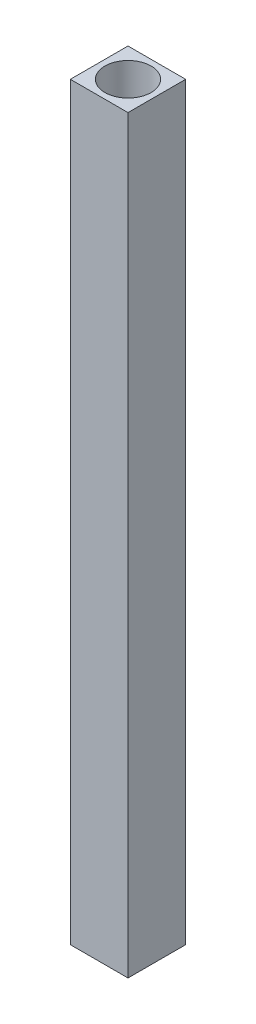
ISO-10303-21;
HEADER;
FILE_DESCRIPTION(('STEP AP214'),'2;1');
FILE_NAME('part.step','',(''),(''),'','','');
FILE_SCHEMA(('AUTOMOTIVE_DESIGN { 1 0 10303 214 1 1 1 1 }'));
ENDSEC;
DATA;
#1=APPLICATION_CONTEXT('core data for automotive mechanical design processes');
#2=APPLICATION_PROTOCOL_DEFINITION('international standard','automotive_design',2000,#1);
#3=PRODUCT_CONTEXT('',#1,'mechanical');
#4=PRODUCT('Part','Part','',(#3));
#5=PRODUCT_RELATED_PRODUCT_CATEGORY('part','',(#4));
#6=PRODUCT_DEFINITION_FORMATION('','',#4);
#7=PRODUCT_DEFINITION_CONTEXT('part definition',#1,'design');
#8=PRODUCT_DEFINITION('design','',#6,#7);
#9=PRODUCT_DEFINITION_SHAPE('','',#8);
#10=(LENGTH_UNIT() NAMED_UNIT(*) SI_UNIT(.MILLI.,.METRE.));
#11=(NAMED_UNIT(*) PLANE_ANGLE_UNIT() SI_UNIT($,.RADIAN.));
#12=(NAMED_UNIT(*) SI_UNIT($,.STERADIAN.) SOLID_ANGLE_UNIT());
#13=UNCERTAINTY_MEASURE_WITH_UNIT(LENGTH_MEASURE(1.E-05),#10,'distance_accuracy_value','');
#14=(GEOMETRIC_REPRESENTATION_CONTEXT(3) GLOBAL_UNCERTAINTY_ASSIGNED_CONTEXT((#13)) GLOBAL_UNIT_ASSIGNED_CONTEXT((#10,
#11,#12)) REPRESENTATION_CONTEXT('',''));
#15=CARTESIAN_POINT('',(0.,0.,0.));
#16=DIRECTION('',(0.,0.,1.));
#17=DIRECTION('',(1.,0.,0.));
#18=AXIS2_PLACEMENT_3D('',#15,#16,#17);
#19=CARTESIAN_POINT('',(5.,130.,5.));
#20=DIRECTION('',(-1.,0.,0.));
#21=DIRECTION('',(0.,0.,1.));
#22=AXIS2_PLACEMENT_3D('',#19,#20,#21);
#23=PLANE('',#22);
#24=DIRECTION('',(0.,0.,-1.));
#25=VECTOR('',#24,1.);
#26=CARTESIAN_POINT('',(5.,0.,5.));
#27=LINE('',#26,#25);
#28=CARTESIAN_POINT('',(5.,0.,5.));
#29=VERTEX_POINT('',#28);
#30=CARTESIAN_POINT('',(5.,0.,-5.));
#31=VERTEX_POINT('',#30);
#32=EDGE_CURVE('E106',#29,#31,#27,.T.);
#33=ORIENTED_EDGE('',*,*,#32,.T.);
#34=DIRECTION('',(0.,-1.,0.));
#35=VECTOR('',#34,1.);
#36=CARTESIAN_POINT('',(5.,130.,-5.));
#37=LINE('',#36,#35);
#38=CARTESIAN_POINT('',(5.,130.,-5.));
#39=VERTEX_POINT('',#38);
#40=EDGE_CURVE('E11',#39,#31,#37,.T.);
#41=ORIENTED_EDGE('',*,*,#40,.F.);
#42=DIRECTION('',(0.,0.,-1.));
#43=VECTOR('',#42,1.);
#44=CARTESIAN_POINT('',(5.,130.,5.));
#45=LINE('',#44,#43);
#46=CARTESIAN_POINT('',(5.,130.,5.));
#47=VERTEX_POINT('',#46);
#48=EDGE_CURVE('E90',#47,#39,#45,.T.);
#49=ORIENTED_EDGE('',*,*,#48,.F.);
#50=DIRECTION('',(0.,-1.,0.));
#51=VECTOR('',#50,1.);
#52=CARTESIAN_POINT('',(5.,130.,5.));
#53=LINE('',#52,#51);
#54=EDGE_CURVE('E102',#47,#29,#53,.T.);
#55=ORIENTED_EDGE('',*,*,#54,.T.);
#56=EDGE_LOOP('',(#33,#41,#49,#55));
#57=FACE_BOUND('',#56,.T.);
#58=ADVANCED_FACE('F38',(#57),#23,.F.);
#59=CARTESIAN_POINT('',(-5.,130.,-5.));
#60=DIRECTION('',(0.,0.,1.));
#61=DIRECTION('',(1.,0.,0.));
#62=AXIS2_PLACEMENT_3D('',#59,#60,#61);
#63=PLANE('',#62);
#64=DIRECTION('',(-1.,0.,0.));
#65=VECTOR('',#64,1.);
#66=CARTESIAN_POINT('',(-5.,0.,-5.));
#67=LINE('',#66,#65);
#68=CARTESIAN_POINT('',(-5.,0.,-5.));
#69=VERTEX_POINT('',#68);
#70=EDGE_CURVE('E95',#31,#69,#67,.T.);
#71=ORIENTED_EDGE('',*,*,#70,.T.);
#72=DIRECTION('',(0.,-1.,0.));
#73=VECTOR('',#72,1.);
#74=CARTESIAN_POINT('',(-5.,130.,-5.));
#75=LINE('',#74,#73);
#76=CARTESIAN_POINT('',(-5.,130.,-5.));
#77=VERTEX_POINT('',#76);
#78=EDGE_CURVE('E47',#77,#69,#75,.T.);
#79=ORIENTED_EDGE('',*,*,#78,.F.);
#80=DIRECTION('',(-1.,0.,0.));
#81=VECTOR('',#80,1.);
#82=CARTESIAN_POINT('',(-5.,130.,-5.));
#83=LINE('',#82,#81);
#84=EDGE_CURVE('E85',#39,#77,#83,.T.);
#85=ORIENTED_EDGE('',*,*,#84,.F.);
#86=ORIENTED_EDGE('',*,*,#40,.T.);
#87=EDGE_LOOP('',(#71,#79,#85,#86));
#88=FACE_BOUND('',#87,.T.);
#89=ADVANCED_FACE('F94',(#88),#63,.F.);
#90=CARTESIAN_POINT('',(-5.,130.,5.));
#91=DIRECTION('',(1.,0.,0.));
#92=DIRECTION('',(0.,0.,-1.));
#93=AXIS2_PLACEMENT_3D('',#90,#91,#92);
#94=PLANE('',#93);
#95=DIRECTION('',(0.,0.,1.));
#96=VECTOR('',#95,1.);
#97=CARTESIAN_POINT('',(-5.,0.,5.));
#98=LINE('',#97,#96);
#99=CARTESIAN_POINT('',(-5.,0.,5.));
#100=VERTEX_POINT('',#99);
#101=EDGE_CURVE('E72',#69,#100,#98,.T.);
#102=ORIENTED_EDGE('',*,*,#101,.T.);
#103=DIRECTION('',(0.,-1.,0.));
#104=VECTOR('',#103,1.);
#105=CARTESIAN_POINT('',(-5.,130.,5.));
#106=LINE('',#105,#104);
#107=CARTESIAN_POINT('',(-5.,130.,5.));
#108=VERTEX_POINT('',#107);
#109=EDGE_CURVE('E97',#108,#100,#106,.T.);
#110=ORIENTED_EDGE('',*,*,#109,.F.);
#111=DIRECTION('',(0.,0.,1.));
#112=VECTOR('',#111,1.);
#113=CARTESIAN_POINT('',(-5.,130.,5.));
#114=LINE('',#113,#112);
#115=EDGE_CURVE('E88',#77,#108,#114,.T.);
#116=ORIENTED_EDGE('',*,*,#115,.F.);
#117=ORIENTED_EDGE('',*,*,#78,.T.);
#118=EDGE_LOOP('',(#102,#110,#116,#117));
#119=FACE_BOUND('',#118,.T.);
#120=ADVANCED_FACE('F98',(#119),#94,.F.);
#121=CARTESIAN_POINT('',(-5.,130.,5.));
#122=DIRECTION('',(0.,0.,-1.));
#123=DIRECTION('',(-1.,0.,0.));
#124=AXIS2_PLACEMENT_3D('',#121,#122,#123);
#125=PLANE('',#124);
#126=DIRECTION('',(1.,0.,0.));
#127=VECTOR('',#126,1.);
#128=CARTESIAN_POINT('',(-5.,0.,5.));
#129=LINE('',#128,#127);
#130=EDGE_CURVE('E78',#100,#29,#129,.T.);
#131=ORIENTED_EDGE('',*,*,#130,.T.);
#132=ORIENTED_EDGE('',*,*,#54,.F.);
#133=DIRECTION('',(1.,0.,0.));
#134=VECTOR('',#133,1.);
#135=CARTESIAN_POINT('',(-5.,130.,5.));
#136=LINE('',#135,#134);
#137=EDGE_CURVE('E55',#108,#47,#136,.T.);
#138=ORIENTED_EDGE('',*,*,#137,.F.);
#139=ORIENTED_EDGE('',*,*,#109,.T.);
#140=EDGE_LOOP('',(#131,#132,#138,#139));
#141=FACE_BOUND('',#140,.T.);
#142=ADVANCED_FACE('F120',(#141),#125,.F.);
#143=CARTESIAN_POINT('',(0.,130.,0.));
#144=DIRECTION('',(0.,-1.,0.));
#145=DIRECTION('',(0.,0.,-1.));
#146=AXIS2_PLACEMENT_3D('',#143,#144,#145);
#147=PLANE('',#146);
#148=CARTESIAN_POINT('',(0.,130.,0.));
#149=DIRECTION('',(0.,-1.,0.));
#150=DIRECTION('',(0.,0.,-1.));
#151=AXIS2_PLACEMENT_3D('',#148,#149,#150);
#152=CIRCLE('',#151,4.);
#153=CARTESIAN_POINT('',(0.,130.,-4.));
#154=VERTEX_POINT('',#153);
#155=EDGE_CURVE('E127',#154,#154,#152,.T.);
#156=ORIENTED_EDGE('',*,*,#155,.T.);
#157=EDGE_LOOP('',(#156));
#158=FACE_BOUND('',#157,.T.);
#159=ORIENTED_EDGE('',*,*,#48,.T.);
#160=ORIENTED_EDGE('',*,*,#84,.T.);
#161=ORIENTED_EDGE('',*,*,#115,.T.);
#162=ORIENTED_EDGE('',*,*,#137,.T.);
#163=EDGE_LOOP('',(#159,#160,#161,#162));
#164=FACE_BOUND('',#163,.T.);
#165=ADVANCED_FACE('F86',(#158,#164),#147,.F.);
#166=CARTESIAN_POINT('',(0.,0.,0.));
#167=DIRECTION('',(0.,-1.,0.));
#168=DIRECTION('',(0.,0.,-1.));
#169=AXIS2_PLACEMENT_3D('',#166,#167,#168);
#170=PLANE('',#169);
#171=CARTESIAN_POINT('',(0.,0.,0.));
#172=DIRECTION('',(0.,-1.,0.));
#173=DIRECTION('',(0.,0.,-1.));
#174=AXIS2_PLACEMENT_3D('',#171,#172,#173);
#175=CIRCLE('',#174,4.);
#176=CARTESIAN_POINT('',(0.,0.,-4.));
#177=VERTEX_POINT('',#176);
#178=EDGE_CURVE('E110',#177,#177,#175,.T.);
#179=ORIENTED_EDGE('',*,*,#178,.F.);
#180=EDGE_LOOP('',(#179));
#181=FACE_BOUND('',#180,.T.);
#182=ORIENTED_EDGE('',*,*,#32,.F.);
#183=ORIENTED_EDGE('',*,*,#130,.F.);
#184=ORIENTED_EDGE('',*,*,#101,.F.);
#185=ORIENTED_EDGE('',*,*,#70,.F.);
#186=EDGE_LOOP('',(#182,#183,#184,#185));
#187=FACE_BOUND('',#186,.T.);
#188=ADVANCED_FACE('F123',(#181,#187),#170,.T.);
#189=CARTESIAN_POINT('',(0.,0.,0.));
#190=DIRECTION('',(0.,1.,0.));
#191=DIRECTION('',(0.,0.,1.));
#192=AXIS2_PLACEMENT_3D('',#189,#190,#191);
#193=CYLINDRICAL_SURFACE('',#192,4.);
#194=ORIENTED_EDGE('',*,*,#178,.T.);
#195=EDGE_LOOP('',(#194));
#196=FACE_BOUND('',#195,.T.);
#197=ORIENTED_EDGE('',*,*,#155,.F.);
#198=EDGE_LOOP('',(#197));
#199=FACE_BOUND('',#198,.T.);
#200=ADVANCED_FACE('F135',(#196,#199),#193,.F.);
#201=CLOSED_SHELL('',(#58,#89,#120,#142,#165,#188,#200));
#202=MANIFOLD_SOLID_BREP('B2',#201);
#203=ADVANCED_BREP_SHAPE_REPRESENTATION('',(#18,#202),#14);
#204=SHAPE_DEFINITION_REPRESENTATION(#9,#203);
ENDSEC;
END-ISO-10303-21;
